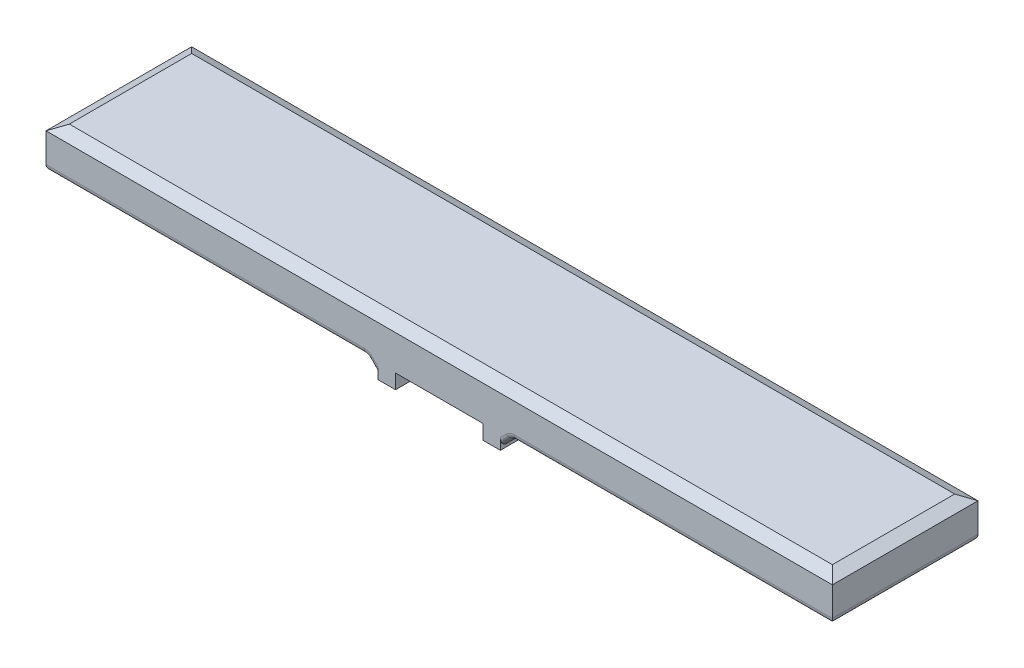
ISO-10303-21;
HEADER;
FILE_DESCRIPTION(('STEP AP214'),'2;1');
FILE_NAME('part.step','',(''),(''),'','','');
FILE_SCHEMA(('AUTOMOTIVE_DESIGN { 1 0 10303 214 1 1 1 1 }'));
ENDSEC;
DATA;
#1=APPLICATION_CONTEXT('core data for automotive mechanical design processes');
#2=APPLICATION_PROTOCOL_DEFINITION('international standard','automotive_design',2000,#1);
#3=PRODUCT_CONTEXT('',#1,'mechanical');
#4=PRODUCT('Part','Part','',(#3));
#5=PRODUCT_RELATED_PRODUCT_CATEGORY('part','',(#4));
#6=PRODUCT_DEFINITION_FORMATION('','',#4);
#7=PRODUCT_DEFINITION_CONTEXT('part definition',#1,'design');
#8=PRODUCT_DEFINITION('design','',#6,#7);
#9=PRODUCT_DEFINITION_SHAPE('','',#8);
#10=(LENGTH_UNIT() NAMED_UNIT(*) SI_UNIT(.MILLI.,.METRE.));
#11=(NAMED_UNIT(*) PLANE_ANGLE_UNIT() SI_UNIT($,.RADIAN.));
#12=(NAMED_UNIT(*) SI_UNIT($,.STERADIAN.) SOLID_ANGLE_UNIT());
#13=UNCERTAINTY_MEASURE_WITH_UNIT(LENGTH_MEASURE(1.E-05),#10,'distance_accuracy_value','');
#14=(GEOMETRIC_REPRESENTATION_CONTEXT(3) GLOBAL_UNCERTAINTY_ASSIGNED_CONTEXT((#13)) GLOBAL_UNIT_ASSIGNED_CONTEXT((#10,
#11,#12)) REPRESENTATION_CONTEXT('',''));
#15=CARTESIAN_POINT('',(0.,0.,0.));
#16=DIRECTION('',(0.,0.,1.));
#17=DIRECTION('',(1.,0.,0.));
#18=AXIS2_PLACEMENT_3D('',#15,#16,#17);
#19=CARTESIAN_POINT('',(0.,0.,0.));
#20=DIRECTION('',(0.,1.,0.));
#21=DIRECTION('',(0.,0.,1.));
#22=AXIS2_PLACEMENT_3D('',#19,#20,#21);
#23=PLANE('',#22);
#24=CARTESIAN_POINT('',(0.,0.,0.));
#25=DIRECTION('',(0.,1.,0.));
#26=DIRECTION('',(0.,0.,1.));
#27=AXIS2_PLACEMENT_3D('',#24,#25,#26);
#28=CIRCLE('',#27,10.);
#29=CARTESIAN_POINT('',(0.,0.,10.));
#30=VERTEX_POINT('',#29);
#31=EDGE_CURVE('E379',#30,#30,#28,.F.);
#32=ORIENTED_EDGE('',*,*,#31,.F.);
#33=EDGE_LOOP('',(#32));
#34=FACE_BOUND('',#33,.T.);
#35=DIRECTION('',(0.,0.,-1.));
#36=VECTOR('',#35,1.);
#37=CARTESIAN_POINT('',(75.,0.,125.));
#38=LINE('',#37,#36);
#39=CARTESIAN_POINT('',(75.,0.,125.));
#40=VERTEX_POINT('',#39);
#41=CARTESIAN_POINT('',(75.,0.,-125.));
#42=VERTEX_POINT('',#41);
#43=EDGE_CURVE('E228',#40,#42,#38,.T.);
#44=ORIENTED_EDGE('',*,*,#43,.F.);
#45=DIRECTION('',(1.,0.,0.));
#46=VECTOR('',#45,1.);
#47=CARTESIAN_POINT('',(-675.,0.,125.));
#48=LINE('',#47,#46);
#49=CARTESIAN_POINT('',(-75.,0.,125.));
#50=VERTEX_POINT('',#49);
#51=EDGE_CURVE('E259',#50,#40,#48,.T.);
#52=ORIENTED_EDGE('',*,*,#51,.F.);
#53=DIRECTION('',(0.,0.,1.));
#54=VECTOR('',#53,1.);
#55=CARTESIAN_POINT('',(-75.,0.,125.));
#56=LINE('',#55,#54);
#57=CARTESIAN_POINT('',(-75.,0.,-125.));
#58=VERTEX_POINT('',#57);
#59=EDGE_CURVE('E231',#58,#50,#56,.T.);
#60=ORIENTED_EDGE('',*,*,#59,.F.);
#61=DIRECTION('',(1.,0.,0.));
#62=VECTOR('',#61,1.);
#63=CARTESIAN_POINT('',(-675.,0.,-125.));
#64=LINE('',#63,#62);
#65=EDGE_CURVE('E262',#58,#42,#64,.T.);
#66=ORIENTED_EDGE('',*,*,#65,.T.);
#67=EDGE_LOOP('',(#44,#52,#60,#66));
#68=FACE_BOUND('',#67,.T.);
#69=ADVANCED_FACE('F34',(#34,#68),#23,.F.);
#70=DIRECTION('',(1.,0.,0.));
#71=VECTOR('',#70,1.);
#72=CARTESIAN_POINT('',(675.,0.,-115.));
#73=LINE('',#72,#71);
#74=CARTESIAN_POINT('',(129.142135623731,0.,-115.));
#75=VERTEX_POINT('',#74);
#76=CARTESIAN_POINT('',(665.,0.,-115.));
#77=VERTEX_POINT('',#76);
#78=EDGE_CURVE('E354',#75,#77,#73,.T.);
#79=ORIENTED_EDGE('',*,*,#78,.T.);
#80=DIRECTION('',(0.,0.,1.));
#81=VECTOR('',#80,1.);
#82=CARTESIAN_POINT('',(665.,0.,125.));
#83=LINE('',#82,#81);
#84=CARTESIAN_POINT('',(665.,0.,115.));
#85=VERTEX_POINT('',#84);
#86=EDGE_CURVE('E356',#77,#85,#83,.T.);
#87=ORIENTED_EDGE('',*,*,#86,.T.);
#88=DIRECTION('',(1.,0.,0.));
#89=VECTOR('',#88,1.);
#90=CARTESIAN_POINT('',(0.,0.,115.));
#91=LINE('',#90,#89);
#92=CARTESIAN_POINT('',(129.142135623731,0.,115.));
#93=VERTEX_POINT('',#92);
#94=EDGE_CURVE('E350',#85,#93,#91,.F.);
#95=ORIENTED_EDGE('',*,*,#94,.T.);
#96=DIRECTION('',(0.,0.,1.));
#97=VECTOR('',#96,1.);
#98=CARTESIAN_POINT('',(129.142135623731,0.,-125.));
#99=LINE('',#98,#97);
#100=EDGE_CURVE('E352',#93,#75,#99,.F.);
#101=ORIENTED_EDGE('',*,*,#100,.T.);
#102=EDGE_LOOP('',(#79,#87,#95,#101));
#103=FACE_BOUND('',#102,.T.);
#104=ADVANCED_FACE('F441',(#103),#23,.F.);
#105=DIRECTION('',(1.,0.,0.));
#106=VECTOR('',#105,1.);
#107=CARTESIAN_POINT('',(0.,0.,115.));
#108=LINE('',#107,#106);
#109=CARTESIAN_POINT('',(-129.142135623731,0.,115.));
#110=VERTEX_POINT('',#109);
#111=CARTESIAN_POINT('',(-665.,0.,115.));
#112=VERTEX_POINT('',#111);
#113=EDGE_CURVE('E50',#110,#112,#108,.F.);
#114=ORIENTED_EDGE('',*,*,#113,.T.);
#115=DIRECTION('',(0.,0.,1.));
#116=VECTOR('',#115,1.);
#117=CARTESIAN_POINT('',(-665.,0.,0.));
#118=LINE('',#117,#116);
#119=CARTESIAN_POINT('',(-665.,0.,-115.));
#120=VERTEX_POINT('',#119);
#121=EDGE_CURVE('E367',#112,#120,#118,.F.);
#122=ORIENTED_EDGE('',*,*,#121,.T.);
#123=DIRECTION('',(1.,0.,0.));
#124=VECTOR('',#123,1.);
#125=CARTESIAN_POINT('',(-125.,0.,-115.));
#126=LINE('',#125,#124);
#127=CARTESIAN_POINT('',(-129.142135623731,0.,-115.));
#128=VERTEX_POINT('',#127);
#129=EDGE_CURVE('E363',#120,#128,#126,.T.);
#130=ORIENTED_EDGE('',*,*,#129,.T.);
#131=DIRECTION('',(0.,0.,-1.));
#132=VECTOR('',#131,1.);
#133=CARTESIAN_POINT('',(-129.142135623731,0.,125.));
#134=LINE('',#133,#132);
#135=EDGE_CURVE('E55',#128,#110,#134,.F.);
#136=ORIENTED_EDGE('',*,*,#135,.T.);
#137=EDGE_LOOP('',(#114,#122,#130,#136));
#138=FACE_BOUND('',#137,.T.);
#139=ADVANCED_FACE('F444',(#138),#23,.F.);
#140=CARTESIAN_POINT('',(-675.,70.,-125.));
#141=DIRECTION('',(1.,0.,0.));
#142=DIRECTION('',(0.,0.,-1.));
#143=AXIS2_PLACEMENT_3D('',#140,#141,#142);
#144=PLANE('',#143);
#145=DIRECTION('',(0.,-1.,0.));
#146=VECTOR('',#145,1.);
#147=CARTESIAN_POINT('',(-675.,70.,-125.));
#148=LINE('',#147,#146);
#149=CARTESIAN_POINT('',(-675.,60.,-125.));
#150=VERTEX_POINT('',#149);
#151=CARTESIAN_POINT('',(-675.,10.,-125.));
#152=VERTEX_POINT('',#151);
#153=EDGE_CURVE('E265',#150,#152,#148,.T.);
#154=ORIENTED_EDGE('',*,*,#153,.T.);
#155=DIRECTION('',(0.,0.,1.));
#156=VECTOR('',#155,1.);
#157=CARTESIAN_POINT('',(-675.,10.,-125.));
#158=LINE('',#157,#156);
#159=CARTESIAN_POINT('',(-675.,10.,125.));
#160=VERTEX_POINT('',#159);
#161=EDGE_CURVE('E361',#152,#160,#158,.T.);
#162=ORIENTED_EDGE('',*,*,#161,.T.);
#163=DIRECTION('',(0.,-1.,0.));
#164=VECTOR('',#163,1.);
#165=CARTESIAN_POINT('',(-675.,70.,125.));
#166=LINE('',#165,#164);
#167=CARTESIAN_POINT('',(-675.,60.,125.));
#168=VERTEX_POINT('',#167);
#169=EDGE_CURVE('E274',#168,#160,#166,.T.);
#170=ORIENTED_EDGE('',*,*,#169,.F.);
#171=DIRECTION('',(0.,0.,-1.));
#172=VECTOR('',#171,1.);
#173=CARTESIAN_POINT('',(-675.,60.,-125.));
#174=LINE('',#173,#172);
#175=EDGE_CURVE('E293',#168,#150,#174,.T.);
#176=ORIENTED_EDGE('',*,*,#175,.T.);
#177=EDGE_LOOP('',(#154,#162,#170,#176));
#178=FACE_BOUND('',#177,.T.);
#179=ADVANCED_FACE('F454',(#178),#144,.F.);
#180=CARTESIAN_POINT('',(-675.,70.,125.));
#181=DIRECTION('',(0.,0.,-1.));
#182=DIRECTION('',(-1.,0.,0.));
#183=AXIS2_PLACEMENT_3D('',#180,#181,#182);
#184=PLANE('',#183);
#185=DIRECTION('',(0.,1.,0.));
#186=VECTOR('',#185,1.);
#187=CARTESIAN_POINT('',(105.,-25.,125.));
#188=LINE('',#187,#186);
#189=CARTESIAN_POINT('',(105.,-25.,125.));
#190=VERTEX_POINT('',#189);
#191=CARTESIAN_POINT('',(105.,-5.85786437626877,125.));
#192=VERTEX_POINT('',#191);
#193=EDGE_CURVE('E236',#190,#192,#188,.T.);
#194=ORIENTED_EDGE('',*,*,#193,.T.);
#195=DIRECTION('',(-0.707106781186546,-0.70710678118655,0.));
#196=VECTOR('',#195,1.);
#197=CARTESIAN_POINT('',(-247.071067811863,-357.928932188134,125.));
#198=LINE('',#197,#196);
#199=CARTESIAN_POINT('',(115.,4.14213562373093,125.));
#200=VERTEX_POINT('',#199);
#201=EDGE_CURVE('E342',#192,#200,#198,.F.);
#202=ORIENTED_EDGE('',*,*,#201,.T.);
#203=CARTESIAN_POINT('',(129.142135623731,-10.,125.));
#204=DIRECTION('',(0.,0.,-1.));
#205=DIRECTION('',(-1.,0.,0.));
#206=AXIS2_PLACEMENT_3D('',#203,#204,#205);
#207=CIRCLE('',#206,20.);
#208=CARTESIAN_POINT('',(129.142135623731,10.,125.));
#209=VERTEX_POINT('',#208);
#210=EDGE_CURVE('E339',#209,#200,#207,.F.);
#211=ORIENTED_EDGE('',*,*,#210,.F.);
#212=DIRECTION('',(1.,0.,0.));
#213=VECTOR('',#212,1.);
#214=CARTESIAN_POINT('',(-675.,10.,125.));
#215=LINE('',#214,#213);
#216=CARTESIAN_POINT('',(675.,10.,125.));
#217=VERTEX_POINT('',#216);
#218=EDGE_CURVE('E337',#209,#217,#215,.T.);
#219=ORIENTED_EDGE('',*,*,#218,.T.);
#220=DIRECTION('',(0.,-1.,0.));
#221=VECTOR('',#220,1.);
#222=CARTESIAN_POINT('',(675.,70.,125.));
#223=LINE('',#222,#221);
#224=CARTESIAN_POINT('',(675.,60.,125.));
#225=VERTEX_POINT('',#224);
#226=EDGE_CURVE('E271',#225,#217,#223,.T.);
#227=ORIENTED_EDGE('',*,*,#226,.F.);
#228=DIRECTION('',(-1.,0.,0.));
#229=VECTOR('',#228,1.);
#230=CARTESIAN_POINT('',(-675.,60.,125.));
#231=LINE('',#230,#229);
#232=EDGE_CURVE('E291',#225,#168,#231,.T.);
#233=ORIENTED_EDGE('',*,*,#232,.T.);
#234=ORIENTED_EDGE('',*,*,#169,.T.);
#235=DIRECTION('',(1.,0.,0.));
#236=VECTOR('',#235,1.);
#237=CARTESIAN_POINT('',(-675.,10.,125.));
#238=LINE('',#237,#236);
#239=CARTESIAN_POINT('',(-129.142135623731,10.,125.));
#240=VERTEX_POINT('',#239);
#241=EDGE_CURVE('E332',#160,#240,#238,.T.);
#242=ORIENTED_EDGE('',*,*,#241,.T.);
#243=CARTESIAN_POINT('',(-129.142135623731,-10.,125.));
#244=DIRECTION('',(0.,0.,-1.));
#245=DIRECTION('',(-1.,0.,0.));
#246=AXIS2_PLACEMENT_3D('',#243,#244,#245);
#247=CIRCLE('',#246,20.);
#248=CARTESIAN_POINT('',(-115.,4.1421356237309,125.));
#249=VERTEX_POINT('',#248);
#250=EDGE_CURVE('E329',#249,#240,#247,.F.);
#251=ORIENTED_EDGE('',*,*,#250,.F.);
#252=DIRECTION('',(-0.707106781186546,0.70710678118655,0.));
#253=VECTOR('',#252,1.);
#254=CARTESIAN_POINT('',(-427.928932188133,317.071067811866,125.));
#255=LINE('',#254,#253);
#256=CARTESIAN_POINT('',(-105.,-5.85786437626883,125.));
#257=VERTEX_POINT('',#256);
#258=EDGE_CURVE('E334',#249,#257,#255,.F.);
#259=ORIENTED_EDGE('',*,*,#258,.T.);
#260=DIRECTION('',(0.,1.,0.));
#261=VECTOR('',#260,1.);
#262=CARTESIAN_POINT('',(-105.,-25.,125.));
#263=LINE('',#262,#261);
#264=CARTESIAN_POINT('',(-105.,-25.,125.));
#265=VERTEX_POINT('',#264);
#266=EDGE_CURVE('E256',#265,#257,#263,.T.);
#267=ORIENTED_EDGE('',*,*,#266,.F.);
#268=DIRECTION('',(-1.,0.,0.));
#269=VECTOR('',#268,1.);
#270=CARTESIAN_POINT('',(-105.,-25.,125.));
#271=LINE('',#270,#269);
#272=CARTESIAN_POINT('',(-75.,-25.,125.));
#273=VERTEX_POINT('',#272);
#274=EDGE_CURVE('E234',#273,#265,#271,.T.);
#275=ORIENTED_EDGE('',*,*,#274,.F.);
#276=DIRECTION('',(0.,1.,0.));
#277=VECTOR('',#276,1.);
#278=CARTESIAN_POINT('',(-75.,-25.,125.));
#279=LINE('',#278,#277);
#280=EDGE_CURVE('E247',#273,#50,#279,.T.);
#281=ORIENTED_EDGE('',*,*,#280,.T.);
#282=ORIENTED_EDGE('',*,*,#51,.T.);
#283=DIRECTION('',(0.,1.,0.));
#284=VECTOR('',#283,1.);
#285=CARTESIAN_POINT('',(75.,-25.,125.));
#286=LINE('',#285,#284);
#287=CARTESIAN_POINT('',(75.,-25.,125.));
#288=VERTEX_POINT('',#287);
#289=EDGE_CURVE('E644',#288,#40,#286,.T.);
#290=ORIENTED_EDGE('',*,*,#289,.F.);
#291=DIRECTION('',(-1.,0.,0.));
#292=VECTOR('',#291,1.);
#293=CARTESIAN_POINT('',(105.,-25.,125.));
#294=LINE('',#293,#292);
#295=EDGE_CURVE('E224',#190,#288,#294,.T.);
#296=ORIENTED_EDGE('',*,*,#295,.F.);
#297=EDGE_LOOP('',(#194,#202,#211,#219,#227,#233,#234,#242,#251,#259,#267,#275,#281,#282,#290,#296));
#298=FACE_BOUND('',#297,.T.);
#299=ADVANCED_FACE('F458',(#298),#184,.F.);
#300=CARTESIAN_POINT('',(675.,70.,-125.));
#301=DIRECTION('',(1.,0.,0.));
#302=DIRECTION('',(0.,0.,-1.));
#303=AXIS2_PLACEMENT_3D('',#300,#301,#302);
#304=PLANE('',#303);
#305=ORIENTED_EDGE('',*,*,#226,.T.);
#306=DIRECTION('',(0.,0.,1.));
#307=VECTOR('',#306,1.);
#308=CARTESIAN_POINT('',(675.,10.,-125.));
#309=LINE('',#308,#307);
#310=CARTESIAN_POINT('',(675.,10.,-125.));
#311=VERTEX_POINT('',#310);
#312=EDGE_CURVE('E359',#217,#311,#309,.F.);
#313=ORIENTED_EDGE('',*,*,#312,.T.);
#314=DIRECTION('',(0.,-1.,0.));
#315=VECTOR('',#314,1.);
#316=CARTESIAN_POINT('',(675.,70.,-125.));
#317=LINE('',#316,#315);
#318=CARTESIAN_POINT('',(675.,60.,-125.));
#319=VERTEX_POINT('',#318);
#320=EDGE_CURVE('E268',#319,#311,#317,.T.);
#321=ORIENTED_EDGE('',*,*,#320,.F.);
#322=DIRECTION('',(0.,0.,1.));
#323=VECTOR('',#322,1.);
#324=CARTESIAN_POINT('',(675.,60.,-125.));
#325=LINE('',#324,#323);
#326=EDGE_CURVE('E289',#319,#225,#325,.T.);
#327=ORIENTED_EDGE('',*,*,#326,.T.);
#328=EDGE_LOOP('',(#305,#313,#321,#327));
#329=FACE_BOUND('',#328,.T.);
#330=ADVANCED_FACE('F464',(#329),#304,.T.);
#331=CARTESIAN_POINT('',(-675.,70.,-125.));
#332=DIRECTION('',(0.,0.,-1.));
#333=DIRECTION('',(-1.,0.,0.));
#334=AXIS2_PLACEMENT_3D('',#331,#332,#333);
#335=PLANE('',#334);
#336=DIRECTION('',(0.707106781186546,0.70710678118655,0.));
#337=VECTOR('',#336,1.);
#338=CARTESIAN_POINT('',(97.9289321881345,-12.9289321881343,-125.));
#339=LINE('',#338,#337);
#340=CARTESIAN_POINT('',(115.,4.14213562373095,-125.));
#341=VERTEX_POINT('',#340);
#342=CARTESIAN_POINT('',(105.,-5.85786437626875,-125.));
#343=VERTEX_POINT('',#342);
#344=EDGE_CURVE('E321',#341,#343,#339,.F.);
#345=ORIENTED_EDGE('',*,*,#344,.T.);
#346=DIRECTION('',(0.,1.,0.));
#347=VECTOR('',#346,1.);
#348=CARTESIAN_POINT('',(105.,-25.,-125.));
#349=LINE('',#348,#347);
#350=CARTESIAN_POINT('',(105.,-25.,-125.));
#351=VERTEX_POINT('',#350);
#352=EDGE_CURVE('E215',#351,#343,#349,.T.);
#353=ORIENTED_EDGE('',*,*,#352,.F.);
#354=DIRECTION('',(1.,0.,0.));
#355=VECTOR('',#354,1.);
#356=CARTESIAN_POINT('',(105.,-25.,-125.));
#357=LINE('',#356,#355);
#358=CARTESIAN_POINT('',(75.,-25.,-125.));
#359=VERTEX_POINT('',#358);
#360=EDGE_CURVE('E207',#359,#351,#357,.T.);
#361=ORIENTED_EDGE('',*,*,#360,.F.);
#362=DIRECTION('',(0.,1.,0.));
#363=VECTOR('',#362,1.);
#364=CARTESIAN_POINT('',(75.,-25.,-125.));
#365=LINE('',#364,#363);
#366=EDGE_CURVE('E213',#359,#42,#365,.T.);
#367=ORIENTED_EDGE('',*,*,#366,.T.);
#368=ORIENTED_EDGE('',*,*,#65,.F.);
#369=DIRECTION('',(0.,1.,0.));
#370=VECTOR('',#369,1.);
#371=CARTESIAN_POINT('',(-75.,-25.,-125.));
#372=LINE('',#371,#370);
#373=CARTESIAN_POINT('',(-75.,-25.,-125.));
#374=VERTEX_POINT('',#373);
#375=EDGE_CURVE('E251',#374,#58,#372,.T.);
#376=ORIENTED_EDGE('',*,*,#375,.F.);
#377=DIRECTION('',(1.,0.,0.));
#378=VECTOR('',#377,1.);
#379=CARTESIAN_POINT('',(-105.,-25.,-125.));
#380=LINE('',#379,#378);
#381=CARTESIAN_POINT('',(-105.,-25.,-125.));
#382=VERTEX_POINT('',#381);
#383=EDGE_CURVE('E244',#382,#374,#380,.T.);
#384=ORIENTED_EDGE('',*,*,#383,.F.);
#385=DIRECTION('',(0.,1.,0.));
#386=VECTOR('',#385,1.);
#387=CARTESIAN_POINT('',(-105.,-25.,-125.));
#388=LINE('',#387,#386);
#389=CARTESIAN_POINT('',(-105.,-5.85786437626886,-125.));
#390=VERTEX_POINT('',#389);
#391=EDGE_CURVE('E254',#382,#390,#388,.T.);
#392=ORIENTED_EDGE('',*,*,#391,.T.);
#393=DIRECTION('',(0.707106781186546,-0.70710678118655,0.));
#394=VECTOR('',#393,1.);
#395=CARTESIAN_POINT('',(-117.928932188134,7.07106781186539,-125.));
#396=LINE('',#395,#394);
#397=CARTESIAN_POINT('',(-115.,4.14213562373089,-125.));
#398=VERTEX_POINT('',#397);
#399=EDGE_CURVE('E314',#390,#398,#396,.F.);
#400=ORIENTED_EDGE('',*,*,#399,.T.);
#401=CARTESIAN_POINT('',(-129.142135623731,-10.,-125.));
#402=DIRECTION('',(0.,0.,-1.));
#403=DIRECTION('',(-1.,0.,0.));
#404=AXIS2_PLACEMENT_3D('',#401,#402,#403);
#405=CIRCLE('',#404,20.);
#406=CARTESIAN_POINT('',(-129.142135623731,10.,-125.));
#407=VERTEX_POINT('',#406);
#408=EDGE_CURVE('E311',#407,#398,#405,.T.);
#409=ORIENTED_EDGE('',*,*,#408,.F.);
#410=DIRECTION('',(1.,0.,0.));
#411=VECTOR('',#410,1.);
#412=CARTESIAN_POINT('',(-675.,10.,-125.));
#413=LINE('',#412,#411);
#414=EDGE_CURVE('E309',#407,#152,#413,.F.);
#415=ORIENTED_EDGE('',*,*,#414,.T.);
#416=ORIENTED_EDGE('',*,*,#153,.F.);
#417=DIRECTION('',(1.,0.,0.));
#418=VECTOR('',#417,1.);
#419=CARTESIAN_POINT('',(-675.,60.,-125.));
#420=LINE('',#419,#418);
#421=EDGE_CURVE('E277',#150,#319,#420,.T.);
#422=ORIENTED_EDGE('',*,*,#421,.T.);
#423=ORIENTED_EDGE('',*,*,#320,.T.);
#424=DIRECTION('',(1.,0.,0.));
#425=VECTOR('',#424,1.);
#426=CARTESIAN_POINT('',(125.,10.,-125.));
#427=LINE('',#426,#425);
#428=CARTESIAN_POINT('',(129.142135623731,10.,-125.));
#429=VERTEX_POINT('',#428);
#430=EDGE_CURVE('E319',#311,#429,#427,.F.);
#431=ORIENTED_EDGE('',*,*,#430,.T.);
#432=CARTESIAN_POINT('',(129.142135623731,-10.,-125.));
#433=DIRECTION('',(0.,0.,-1.));
#434=DIRECTION('',(-1.,0.,0.));
#435=AXIS2_PLACEMENT_3D('',#432,#433,#434);
#436=CIRCLE('',#435,20.);
#437=EDGE_CURVE('E316',#341,#429,#436,.T.);
#438=ORIENTED_EDGE('',*,*,#437,.F.);
#439=EDGE_LOOP('',(#345,#353,#361,#367,#368,#376,#384,#392,#400,#409,#415,#416,#422,#423,#431,#438));
#440=FACE_BOUND('',#439,.T.);
#441=ADVANCED_FACE('F210',(#440),#335,.T.);
#442=CARTESIAN_POINT('',(0.,70.,0.));
#443=DIRECTION('',(0.,1.,0.));
#444=DIRECTION('',(0.,0.,1.));
#445=AXIS2_PLACEMENT_3D('',#442,#443,#444);
#446=PLANE('',#445);
#447=DIRECTION('',(0.,0.,-1.));
#448=VECTOR('',#447,1.);
#449=CARTESIAN_POINT('',(655.,70.,-2.90878432451791E-13));
#450=LINE('',#449,#448);
#451=CARTESIAN_POINT('',(655.,70.,105.));
#452=VERTEX_POINT('',#451);
#453=CARTESIAN_POINT('',(655.,70.,-105.));
#454=VERTEX_POINT('',#453);
#455=EDGE_CURVE('E284',#452,#454,#450,.T.);
#456=ORIENTED_EDGE('',*,*,#455,.T.);
#457=DIRECTION('',(-1.,0.,0.));
#458=VECTOR('',#457,1.);
#459=CARTESIAN_POINT('',(0.,70.,-105.));
#460=LINE('',#459,#458);
#461=CARTESIAN_POINT('',(-655.,70.,-105.));
#462=VERTEX_POINT('',#461);
#463=EDGE_CURVE('E286',#454,#462,#460,.T.);
#464=ORIENTED_EDGE('',*,*,#463,.T.);
#465=DIRECTION('',(0.,0.,1.));
#466=VECTOR('',#465,1.);
#467=CARTESIAN_POINT('',(-655.,70.,125.));
#468=LINE('',#467,#466);
#469=CARTESIAN_POINT('',(-655.,70.,105.));
#470=VERTEX_POINT('',#469);
#471=EDGE_CURVE('E280',#462,#470,#468,.T.);
#472=ORIENTED_EDGE('',*,*,#471,.T.);
#473=DIRECTION('',(1.,0.,0.));
#474=VECTOR('',#473,1.);
#475=CARTESIAN_POINT('',(675.,70.,105.));
#476=LINE('',#475,#474);
#477=EDGE_CURVE('E282',#470,#452,#476,.T.);
#478=ORIENTED_EDGE('',*,*,#477,.T.);
#479=EDGE_LOOP('',(#456,#464,#472,#478));
#480=FACE_BOUND('',#479,.T.);
#481=ADVANCED_FACE('F498',(#480),#446,.T.);
#482=CARTESIAN_POINT('',(0.,70.,105.));
#483=DIRECTION('',(0.,0.894427190999918,0.447213595499954));
#484=DIRECTION('',(-1.,0.,0.));
#485=AXIS2_PLACEMENT_3D('',#482,#483,#484);
#486=PLANE('',#485);
#487=DIRECTION('',(0.666666666666669,-0.33333333333333,0.666666666666667));
#488=VECTOR('',#487,1.);
#489=CARTESIAN_POINT('',(363.888888888887,215.555555555554,-186.111111111112));
#490=LINE('',#489,#488);
#491=EDGE_CURVE('E299',#452,#225,#490,.T.);
#492=ORIENTED_EDGE('',*,*,#491,.F.);
#493=ORIENTED_EDGE('',*,*,#477,.F.);
#494=DIRECTION('',(0.666666666666668,0.33333333333333,-0.666666666666668));
#495=VECTOR('',#494,1.);
#496=CARTESIAN_POINT('',(-608.333333333333,93.3333333333331,58.3333333333331));
#497=LINE('',#496,#495);
#498=EDGE_CURVE('E263',#168,#470,#497,.T.);
#499=ORIENTED_EDGE('',*,*,#498,.F.);
#500=ORIENTED_EDGE('',*,*,#232,.F.);
#501=EDGE_LOOP('',(#492,#493,#499,#500));
#502=FACE_BOUND('',#501,.T.);
#503=ADVANCED_FACE('F492',(#502),#486,.T.);
#504=CARTESIAN_POINT('',(-655.,70.,0.));
#505=DIRECTION('',(-0.447213595499954,0.894427190999918,0.));
#506=DIRECTION('',(0.,0.,-1.));
#507=AXIS2_PLACEMENT_3D('',#504,#505,#506);
#508=PLANE('',#507);
#509=ORIENTED_EDGE('',*,*,#498,.T.);
#510=ORIENTED_EDGE('',*,*,#471,.F.);
#511=DIRECTION('',(0.666666666666668,0.33333333333333,0.666666666666668));
#512=VECTOR('',#511,1.);
#513=CARTESIAN_POINT('',(-608.333333333333,93.3333333333331,-58.3333333333331));
#514=LINE('',#513,#512);
#515=EDGE_CURVE('E297',#150,#462,#514,.T.);
#516=ORIENTED_EDGE('',*,*,#515,.F.);
#517=ORIENTED_EDGE('',*,*,#175,.F.);
#518=EDGE_LOOP('',(#509,#510,#516,#517));
#519=FACE_BOUND('',#518,.T.);
#520=ADVANCED_FACE('F485',(#519),#508,.T.);
#521=CARTESIAN_POINT('',(675.,60.,-125.));
#522=DIRECTION('',(-0.447213595499953,-0.894427190999918,0.));
#523=DIRECTION('',(0.,0.,1.));
#524=AXIS2_PLACEMENT_3D('',#521,#522,#523);
#525=PLANE('',#524);
#526=ORIENTED_EDGE('',*,*,#491,.T.);
#527=ORIENTED_EDGE('',*,*,#326,.F.);
#528=DIRECTION('',(-0.666666666666668,0.33333333333333,0.666666666666667));
#529=VECTOR('',#528,1.);
#530=CARTESIAN_POINT('',(675.,60.,-125.));
#531=LINE('',#530,#529);
#532=EDGE_CURVE('E258',#454,#319,#531,.F.);
#533=ORIENTED_EDGE('',*,*,#532,.F.);
#534=ORIENTED_EDGE('',*,*,#455,.F.);
#535=EDGE_LOOP('',(#526,#527,#533,#534));
#536=FACE_BOUND('',#535,.T.);
#537=ADVANCED_FACE('F478',(#536),#525,.F.);
#538=CARTESIAN_POINT('',(-675.,60.,-125.));
#539=DIRECTION('',(0.,-0.894427190999918,0.447213595499954));
#540=DIRECTION('',(1.,0.,0.));
#541=AXIS2_PLACEMENT_3D('',#538,#539,#540);
#542=PLANE('',#541);
#543=ORIENTED_EDGE('',*,*,#515,.T.);
#544=ORIENTED_EDGE('',*,*,#463,.F.);
#545=ORIENTED_EDGE('',*,*,#532,.T.);
#546=ORIENTED_EDGE('',*,*,#421,.F.);
#547=EDGE_LOOP('',(#543,#544,#545,#546));
#548=FACE_BOUND('',#547,.T.);
#549=ADVANCED_FACE('F470',(#548),#542,.F.);
#550=CARTESIAN_POINT('',(-105.,-25.,125.));
#551=DIRECTION('',(1.,0.,0.));
#552=DIRECTION('',(0.,0.,-1.));
#553=AXIS2_PLACEMENT_3D('',#550,#551,#552);
#554=PLANE('',#553);
#555=ORIENTED_EDGE('',*,*,#266,.T.);
#556=CARTESIAN_POINT('',(-105.,-5.85786437626878,115.));
#557=DIRECTION('',(1.,0.,0.));
#558=DIRECTION('',(0.,1.,0.));
#559=AXIS2_PLACEMENT_3D('',#556,#557,#558);
#560=ELLIPSE('',#559,14.142135623731,10.);
#561=CARTESIAN_POINT('',(-105.,-19.9999999999998,115.));
#562=VERTEX_POINT('',#561);
#563=EDGE_CURVE('E374',#257,#562,#560,.T.);
#564=ORIENTED_EDGE('',*,*,#563,.T.);
#565=DIRECTION('',(0.,0.,-1.));
#566=VECTOR('',#565,1.);
#567=CARTESIAN_POINT('',(-105.,-19.9999999999998,-125.));
#568=LINE('',#567,#566);
#569=CARTESIAN_POINT('',(-105.,-19.9999999999998,-115.));
#570=VERTEX_POINT('',#569);
#571=EDGE_CURVE('E295',#562,#570,#568,.T.);
#572=ORIENTED_EDGE('',*,*,#571,.T.);
#573=CARTESIAN_POINT('',(-105.,-5.85786437626878,-115.));
#574=DIRECTION('',(1.,0.,0.));
#575=DIRECTION('',(0.,1.,0.));
#576=AXIS2_PLACEMENT_3D('',#573,#574,#575);
#577=ELLIPSE('',#576,14.142135623731,10.);
#578=EDGE_CURVE('E376',#570,#390,#577,.T.);
#579=ORIENTED_EDGE('',*,*,#578,.T.);
#580=ORIENTED_EDGE('',*,*,#391,.F.);
#581=DIRECTION('',(0.,0.,-1.));
#582=VECTOR('',#581,1.);
#583=CARTESIAN_POINT('',(-105.,-25.,125.));
#584=LINE('',#583,#582);
#585=EDGE_CURVE('E242',#265,#382,#584,.T.);
#586=ORIENTED_EDGE('',*,*,#585,.F.);
#587=EDGE_LOOP('',(#555,#564,#572,#579,#580,#586));
#588=FACE_BOUND('',#587,.T.);
#589=ADVANCED_FACE('F477',(#588),#554,.F.);
#590=CARTESIAN_POINT('',(-75.,-25.,125.));
#591=DIRECTION('',(-1.,0.,0.));
#592=DIRECTION('',(0.,0.,1.));
#593=AXIS2_PLACEMENT_3D('',#590,#591,#592);
#594=PLANE('',#593);
#595=ORIENTED_EDGE('',*,*,#59,.T.);
#596=ORIENTED_EDGE('',*,*,#280,.F.);
#597=DIRECTION('',(0.,0.,1.));
#598=VECTOR('',#597,1.);
#599=CARTESIAN_POINT('',(-75.,-25.,125.));
#600=LINE('',#599,#598);
#601=EDGE_CURVE('E246',#374,#273,#600,.T.);
#602=ORIENTED_EDGE('',*,*,#601,.F.);
#603=ORIENTED_EDGE('',*,*,#375,.T.);
#604=EDGE_LOOP('',(#595,#596,#602,#603));
#605=FACE_BOUND('',#604,.T.);
#606=ADVANCED_FACE('F652',(#605),#594,.F.);
#607=CARTESIAN_POINT('',(0.,-25.,0.));
#608=DIRECTION('',(0.,1.,0.));
#609=DIRECTION('',(0.,0.,1.));
#610=AXIS2_PLACEMENT_3D('',#607,#608,#609);
#611=PLANE('',#610);
#612=ORIENTED_EDGE('',*,*,#274,.T.);
#613=ORIENTED_EDGE('',*,*,#585,.T.);
#614=ORIENTED_EDGE('',*,*,#383,.T.);
#615=ORIENTED_EDGE('',*,*,#601,.T.);
#616=EDGE_LOOP('',(#612,#613,#614,#615));
#617=FACE_BOUND('',#616,.T.);
#618=ADVANCED_FACE('F656',(#617),#611,.F.);
#619=CARTESIAN_POINT('',(75.,-25.,125.));
#620=DIRECTION('',(1.,0.,0.));
#621=DIRECTION('',(0.,0.,-1.));
#622=AXIS2_PLACEMENT_3D('',#619,#620,#621);
#623=PLANE('',#622);
#624=ORIENTED_EDGE('',*,*,#43,.T.);
#625=ORIENTED_EDGE('',*,*,#366,.F.);
#626=DIRECTION('',(0.,0.,-1.));
#627=VECTOR('',#626,1.);
#628=CARTESIAN_POINT('',(75.,-25.,125.));
#629=LINE('',#628,#627);
#630=EDGE_CURVE('E219',#288,#359,#629,.T.);
#631=ORIENTED_EDGE('',*,*,#630,.F.);
#632=ORIENTED_EDGE('',*,*,#289,.T.);
#633=EDGE_LOOP('',(#624,#625,#631,#632));
#634=FACE_BOUND('',#633,.T.);
#635=ADVANCED_FACE('F230',(#634),#623,.F.);
#636=CARTESIAN_POINT('',(105.,-25.,125.));
#637=DIRECTION('',(-1.,0.,0.));
#638=DIRECTION('',(0.,0.,1.));
#639=AXIS2_PLACEMENT_3D('',#636,#637,#638);
#640=PLANE('',#639);
#641=ORIENTED_EDGE('',*,*,#352,.T.);
#642=CARTESIAN_POINT('',(105.,-5.85786437626873,-115.));
#643=DIRECTION('',(-1.,0.,0.));
#644=DIRECTION('',(0.,-1.,0.));
#645=AXIS2_PLACEMENT_3D('',#642,#643,#644);
#646=ELLIPSE('',#645,14.142135623731,10.);
#647=CARTESIAN_POINT('',(105.,-19.9999999999998,-115.));
#648=VERTEX_POINT('',#647);
#649=EDGE_CURVE('E369',#343,#648,#646,.T.);
#650=ORIENTED_EDGE('',*,*,#649,.T.);
#651=DIRECTION('',(0.,0.,1.));
#652=VECTOR('',#651,1.);
#653=CARTESIAN_POINT('',(105.,-19.9999999999998,125.));
#654=LINE('',#653,#652);
#655=CARTESIAN_POINT('',(105.,-19.9999999999998,115.));
#656=VERTEX_POINT('',#655);
#657=EDGE_CURVE('E306',#648,#656,#654,.T.);
#658=ORIENTED_EDGE('',*,*,#657,.T.);
#659=CARTESIAN_POINT('',(105.,-5.85786437626873,115.));
#660=DIRECTION('',(-1.,0.,0.));
#661=DIRECTION('',(0.,-1.,0.));
#662=AXIS2_PLACEMENT_3D('',#659,#660,#661);
#663=ELLIPSE('',#662,14.142135623731,10.);
#664=EDGE_CURVE('E371',#656,#192,#663,.T.);
#665=ORIENTED_EDGE('',*,*,#664,.T.);
#666=ORIENTED_EDGE('',*,*,#193,.F.);
#667=DIRECTION('',(0.,0.,1.));
#668=VECTOR('',#667,1.);
#669=CARTESIAN_POINT('',(105.,-25.,125.));
#670=LINE('',#669,#668);
#671=EDGE_CURVE('E218',#351,#190,#670,.T.);
#672=ORIENTED_EDGE('',*,*,#671,.F.);
#673=EDGE_LOOP('',(#641,#650,#658,#665,#666,#672));
#674=FACE_BOUND('',#673,.T.);
#675=ADVANCED_FACE('F633',(#674),#640,.F.);
#676=CARTESIAN_POINT('',(0.,-25.,0.));
#677=DIRECTION('',(0.,1.,0.));
#678=DIRECTION('',(0.,0.,1.));
#679=AXIS2_PLACEMENT_3D('',#676,#677,#678);
#680=PLANE('',#679);
#681=ORIENTED_EDGE('',*,*,#630,.T.);
#682=ORIENTED_EDGE('',*,*,#360,.T.);
#683=ORIENTED_EDGE('',*,*,#671,.T.);
#684=ORIENTED_EDGE('',*,*,#295,.T.);
#685=EDGE_LOOP('',(#681,#682,#683,#684));
#686=FACE_BOUND('',#685,.T.);
#687=ADVANCED_FACE('F222',(#686),#680,.F.);
#688=CARTESIAN_POINT('',(-105.,-19.9999999999998,125.));
#689=DIRECTION('',(-0.707106781186549,-0.707106781186545,0.));
#690=DIRECTION('',(0.,0.,1.));
#691=AXIS2_PLACEMENT_3D('',#688,#689,#690);
#692=PLANE('',#691);
#693=ORIENTED_EDGE('',*,*,#571,.F.);
#694=DIRECTION('',(0.707106781186546,-0.70710678118655,0.));
#695=VECTOR('',#694,1.);
#696=CARTESIAN_POINT('',(-105.,-19.9999999999998,115.));
#697=LINE('',#696,#695);
#698=CARTESIAN_POINT('',(-122.071067811865,-2.92893218813454,115.));
#699=VERTEX_POINT('',#698);
#700=EDGE_CURVE('E348',#562,#699,#697,.F.);
#701=ORIENTED_EDGE('',*,*,#700,.T.);
#702=DIRECTION('',(0.,0.,1.));
#703=VECTOR('',#702,1.);
#704=CARTESIAN_POINT('',(-122.071067811865,-2.92893218813454,-125.));
#705=LINE('',#704,#703);
#706=CARTESIAN_POINT('',(-122.071067811865,-2.92893218813454,-115.));
#707=VERTEX_POINT('',#706);
#708=EDGE_CURVE('E344',#699,#707,#705,.F.);
#709=ORIENTED_EDGE('',*,*,#708,.T.);
#710=DIRECTION('',(-0.707106781186546,0.70710678118655,0.));
#711=VECTOR('',#710,1.);
#712=CARTESIAN_POINT('',(-105.,-19.9999999999998,-115.));
#713=LINE('',#712,#711);
#714=EDGE_CURVE('E346',#707,#570,#713,.F.);
#715=ORIENTED_EDGE('',*,*,#714,.T.);
#716=EDGE_LOOP('',(#693,#701,#709,#715));
#717=FACE_BOUND('',#716,.T.);
#718=ADVANCED_FACE('F500',(#717),#692,.T.);
#719=CARTESIAN_POINT('',(105.,-19.9999999999998,125.));
#720=DIRECTION('',(0.707106781186549,-0.707106781186545,0.));
#721=DIRECTION('',(0.,0.,-1.));
#722=AXIS2_PLACEMENT_3D('',#719,#720,#721);
#723=PLANE('',#722);
#724=ORIENTED_EDGE('',*,*,#657,.F.);
#725=DIRECTION('',(-0.707106781186546,-0.70710678118655,0.));
#726=VECTOR('',#725,1.);
#727=CARTESIAN_POINT('',(125.,0.,-115.));
#728=LINE('',#727,#726);
#729=CARTESIAN_POINT('',(122.071067811865,-2.92893218813454,-115.));
#730=VERTEX_POINT('',#729);
#731=EDGE_CURVE('E327',#648,#730,#728,.F.);
#732=ORIENTED_EDGE('',*,*,#731,.T.);
#733=DIRECTION('',(0.,0.,-1.));
#734=VECTOR('',#733,1.);
#735=CARTESIAN_POINT('',(122.071067811865,-2.92893218813454,125.));
#736=LINE('',#735,#734);
#737=CARTESIAN_POINT('',(122.071067811865,-2.92893218813454,115.));
#738=VERTEX_POINT('',#737);
#739=EDGE_CURVE('E323',#730,#738,#736,.F.);
#740=ORIENTED_EDGE('',*,*,#739,.T.);
#741=DIRECTION('',(0.707106781186546,0.70710678118655,0.));
#742=VECTOR('',#741,1.);
#743=CARTESIAN_POINT('',(105.,-19.9999999999998,115.));
#744=LINE('',#743,#742);
#745=EDGE_CURVE('E325',#738,#656,#744,.F.);
#746=ORIENTED_EDGE('',*,*,#745,.T.);
#747=EDGE_LOOP('',(#724,#732,#740,#746));
#748=FACE_BOUND('',#747,.T.);
#749=ADVANCED_FACE('F506',(#748),#723,.T.);
#750=CARTESIAN_POINT('',(-247.071067811863,-357.928932188134,115.));
#751=DIRECTION('',(-0.707106781186546,-0.70710678118655,0.));
#752=DIRECTION('',(0.70710678118655,-0.707106781186546,0.));
#753=AXIS2_PLACEMENT_3D('',#750,#751,#752);
#754=CYLINDRICAL_SURFACE('',#753,10.);
#755=ORIENTED_EDGE('',*,*,#664,.F.);
#756=ORIENTED_EDGE('',*,*,#745,.F.);
#757=CARTESIAN_POINT('',(115.,4.14213562373093,115.));
#758=DIRECTION('',(0.707106781186546,0.707106781186549,0.));
#759=DIRECTION('',(-0.707106781186549,0.707106781186546,0.));
#760=AXIS2_PLACEMENT_3D('',#757,#758,#759);
#761=CIRCLE('',#760,10.);
#762=EDGE_CURVE('E401',#200,#738,#761,.T.);
#763=ORIENTED_EDGE('',*,*,#762,.F.);
#764=ORIENTED_EDGE('',*,*,#201,.F.);
#765=EDGE_LOOP('',(#755,#756,#763,#764));
#766=FACE_BOUND('',#765,.T.);
#767=ADVANCED_FACE('F512',(#766),#754,.T.);
#768=CARTESIAN_POINT('',(-675.,10.,115.));
#769=DIRECTION('',(1.,0.,0.));
#770=DIRECTION('',(0.,0.,-1.));
#771=AXIS2_PLACEMENT_3D('',#768,#769,#770);
#772=CYLINDRICAL_SURFACE('',#771,10.);
#773=CARTESIAN_POINT('',(665.,10.,115.));
#774=DIRECTION('',(0.707106781186547,0.,-0.707106781186548));
#775=DIRECTION('',(0.707106781186548,0.,0.707106781186547));
#776=AXIS2_PLACEMENT_3D('',#773,#774,#775);
#777=ELLIPSE('',#776,14.142135623731,10.);
#778=EDGE_CURVE('E396',#217,#85,#777,.T.);
#779=ORIENTED_EDGE('',*,*,#778,.F.);
#780=ORIENTED_EDGE('',*,*,#218,.F.);
#781=CARTESIAN_POINT('',(129.142135623731,10.,115.));
#782=DIRECTION('',(-1.,0.,0.));
#783=DIRECTION('',(0.,0.,1.));
#784=AXIS2_PLACEMENT_3D('',#781,#782,#783);
#785=CIRCLE('',#784,10.);
#786=EDGE_CURVE('E398',#93,#209,#785,.T.);
#787=ORIENTED_EDGE('',*,*,#786,.F.);
#788=ORIENTED_EDGE('',*,*,#94,.F.);
#789=EDGE_LOOP('',(#779,#780,#787,#788));
#790=FACE_BOUND('',#789,.T.);
#791=ADVANCED_FACE('F538',(#790),#772,.T.);
#792=CARTESIAN_POINT('',(129.142135623731,-10.,115.));
#793=DIRECTION('',(0.,0.,-1.));
#794=DIRECTION('',(-1.,0.,0.));
#795=AXIS2_PLACEMENT_3D('',#792,#793,#794);
#796=TOROIDAL_SURFACE('',#795,20.,10.);
#797=ORIENTED_EDGE('',*,*,#210,.T.);
#798=ORIENTED_EDGE('',*,*,#762,.T.);
#799=CARTESIAN_POINT('',(129.142135623731,-10.,115.));
#800=DIRECTION('',(0.,0.,-1.));
#801=DIRECTION('',(-1.,0.,0.));
#802=AXIS2_PLACEMENT_3D('',#799,#800,#801);
#803=CIRCLE('',#802,10.);
#804=EDGE_CURVE('E393',#93,#738,#803,.F.);
#805=ORIENTED_EDGE('',*,*,#804,.F.);
#806=ORIENTED_EDGE('',*,*,#786,.T.);
#807=EDGE_LOOP('',(#797,#798,#805,#806));
#808=FACE_BOUND('',#807,.T.);
#809=ADVANCED_FACE('F534',(#808),#796,.T.);
#810=CARTESIAN_POINT('',(665.,10.,-2.95319324550292E-13));
#811=DIRECTION('',(0.,0.,-1.));
#812=DIRECTION('',(-1.,0.,0.));
#813=AXIS2_PLACEMENT_3D('',#810,#811,#812);
#814=CYLINDRICAL_SURFACE('',#813,10.);
#815=ORIENTED_EDGE('',*,*,#778,.T.);
#816=ORIENTED_EDGE('',*,*,#86,.F.);
#817=CARTESIAN_POINT('',(665.,10.,-115.));
#818=DIRECTION('',(-0.707106781186548,0.,-0.707106781186547));
#819=DIRECTION('',(-0.707106781186547,0.,0.707106781186548));
#820=AXIS2_PLACEMENT_3D('',#817,#818,#819);
#821=ELLIPSE('',#820,14.1421356237309,10.);
#822=EDGE_CURVE('E390',#311,#77,#821,.T.);
#823=ORIENTED_EDGE('',*,*,#822,.F.);
#824=ORIENTED_EDGE('',*,*,#312,.F.);
#825=EDGE_LOOP('',(#815,#816,#823,#824));
#826=FACE_BOUND('',#825,.T.);
#827=ADVANCED_FACE('F530',(#826),#814,.T.);
#828=CARTESIAN_POINT('',(129.142135623731,-10.,0.));
#829=DIRECTION('',(0.,0.,-1.));
#830=DIRECTION('',(-1.,0.,0.));
#831=AXIS2_PLACEMENT_3D('',#828,#829,#830);
#832=CYLINDRICAL_SURFACE('',#831,10.);
#833=ORIENTED_EDGE('',*,*,#804,.T.);
#834=ORIENTED_EDGE('',*,*,#739,.F.);
#835=CARTESIAN_POINT('',(129.142135623731,-10.,-115.));
#836=DIRECTION('',(0.,0.,-1.));
#837=DIRECTION('',(-1.,0.,0.));
#838=AXIS2_PLACEMENT_3D('',#835,#836,#837);
#839=CIRCLE('',#838,10.);
#840=EDGE_CURVE('E387',#75,#730,#839,.F.);
#841=ORIENTED_EDGE('',*,*,#840,.F.);
#842=ORIENTED_EDGE('',*,*,#100,.F.);
#843=EDGE_LOOP('',(#833,#834,#841,#842));
#844=FACE_BOUND('',#843,.T.);
#845=ADVANCED_FACE('F526',(#844),#832,.F.);
#846=CARTESIAN_POINT('',(0.,10.,-115.));
#847=DIRECTION('',(-1.,0.,0.));
#848=DIRECTION('',(0.,0.,1.));
#849=AXIS2_PLACEMENT_3D('',#846,#847,#848);
#850=CYLINDRICAL_SURFACE('',#849,10.);
#851=ORIENTED_EDGE('',*,*,#822,.T.);
#852=ORIENTED_EDGE('',*,*,#78,.F.);
#853=CARTESIAN_POINT('',(129.142135623731,10.,-115.));
#854=DIRECTION('',(-1.,0.,0.));
#855=DIRECTION('',(0.,0.,1.));
#856=AXIS2_PLACEMENT_3D('',#853,#854,#855);
#857=CIRCLE('',#856,10.);
#858=EDGE_CURVE('E383',#429,#75,#857,.T.);
#859=ORIENTED_EDGE('',*,*,#858,.F.);
#860=ORIENTED_EDGE('',*,*,#430,.F.);
#861=EDGE_LOOP('',(#851,#852,#859,#860));
#862=FACE_BOUND('',#861,.T.);
#863=ADVANCED_FACE('F522',(#862),#850,.T.);
#864=CARTESIAN_POINT('',(129.142135623731,-10.,-115.));
#865=DIRECTION('',(0.,0.,-1.));
#866=DIRECTION('',(-1.,0.,0.));
#867=AXIS2_PLACEMENT_3D('',#864,#865,#866);
#868=TOROIDAL_SURFACE('',#867,20.,10.);
#869=ORIENTED_EDGE('',*,*,#858,.T.);
#870=ORIENTED_EDGE('',*,*,#840,.T.);
#871=CARTESIAN_POINT('',(115.,4.14213562373091,-115.));
#872=DIRECTION('',(0.707106781186546,0.707106781186549,0.));
#873=DIRECTION('',(-0.707106781186549,0.707106781186546,0.));
#874=AXIS2_PLACEMENT_3D('',#871,#872,#873);
#875=CIRCLE('',#874,10.);
#876=EDGE_CURVE('E380',#341,#730,#875,.F.);
#877=ORIENTED_EDGE('',*,*,#876,.F.);
#878=ORIENTED_EDGE('',*,*,#437,.T.);
#879=EDGE_LOOP('',(#869,#870,#877,#878));
#880=FACE_BOUND('',#879,.T.);
#881=ADVANCED_FACE('F518',(#880),#868,.T.);
#882=CARTESIAN_POINT('',(-247.071067811863,-357.928932188134,-115.));
#883=DIRECTION('',(-0.707106781186546,-0.70710678118655,0.));
#884=DIRECTION('',(0.70710678118655,-0.707106781186546,0.));
#885=AXIS2_PLACEMENT_3D('',#882,#883,#884);
#886=CYLINDRICAL_SURFACE('',#885,10.);
#887=ORIENTED_EDGE('',*,*,#876,.T.);
#888=ORIENTED_EDGE('',*,*,#731,.F.);
#889=ORIENTED_EDGE('',*,*,#649,.F.);
#890=ORIENTED_EDGE('',*,*,#344,.F.);
#891=EDGE_LOOP('',(#887,#888,#889,#890));
#892=FACE_BOUND('',#891,.T.);
#893=ADVANCED_FACE('F514',(#892),#886,.T.);
#894=CARTESIAN_POINT('',(-427.928932188133,317.071067811866,-115.));
#895=DIRECTION('',(-0.707106781186546,0.70710678118655,0.));
#896=DIRECTION('',(-0.70710678118655,-0.707106781186546,0.));
#897=AXIS2_PLACEMENT_3D('',#894,#895,#896);
#898=CYLINDRICAL_SURFACE('',#897,10.);
#899=ORIENTED_EDGE('',*,*,#578,.F.);
#900=ORIENTED_EDGE('',*,*,#714,.F.);
#901=CARTESIAN_POINT('',(-115.,4.14213562373089,-115.));
#902=DIRECTION('',(-0.707106781186546,0.707106781186549,0.));
#903=DIRECTION('',(-0.707106781186549,-0.707106781186546,0.));
#904=AXIS2_PLACEMENT_3D('',#901,#902,#903);
#905=CIRCLE('',#904,10.);
#906=EDGE_CURVE('E384',#398,#707,#905,.T.);
#907=ORIENTED_EDGE('',*,*,#906,.F.);
#908=ORIENTED_EDGE('',*,*,#399,.F.);
#909=EDGE_LOOP('',(#899,#900,#907,#908));
#910=FACE_BOUND('',#909,.T.);
#911=ADVANCED_FACE('F517',(#910),#898,.T.);
#912=CARTESIAN_POINT('',(0.,10.,-115.));
#913=DIRECTION('',(-1.,0.,0.));
#914=DIRECTION('',(0.,0.,1.));
#915=AXIS2_PLACEMENT_3D('',#912,#913,#914);
#916=CYLINDRICAL_SURFACE('',#915,10.);
#917=CARTESIAN_POINT('',(-665.,10.,-115.));
#918=DIRECTION('',(-0.707106781186547,0.,0.707106781186547));
#919=DIRECTION('',(-0.707106781186547,0.,-0.707106781186547));
#920=AXIS2_PLACEMENT_3D('',#917,#918,#919);
#921=ELLIPSE('',#920,14.1421356237309,10.);
#922=EDGE_CURVE('E419',#152,#120,#921,.T.);
#923=ORIENTED_EDGE('',*,*,#922,.F.);
#924=ORIENTED_EDGE('',*,*,#414,.F.);
#925=CARTESIAN_POINT('',(-129.142135623731,10.,-115.));
#926=DIRECTION('',(1.,0.,0.));
#927=DIRECTION('',(0.,0.,-1.));
#928=AXIS2_PLACEMENT_3D('',#925,#926,#927);
#929=CIRCLE('',#928,10.);
#930=EDGE_CURVE('E421',#128,#407,#929,.T.);
#931=ORIENTED_EDGE('',*,*,#930,.F.);
#932=ORIENTED_EDGE('',*,*,#129,.F.);
#933=EDGE_LOOP('',(#923,#924,#931,#932));
#934=FACE_BOUND('',#933,.T.);
#935=ADVANCED_FACE('F569',(#934),#916,.T.);
#936=CARTESIAN_POINT('',(-129.142135623731,-10.,-115.));
#937=DIRECTION('',(0.,0.,-1.));
#938=DIRECTION('',(-1.,0.,0.));
#939=AXIS2_PLACEMENT_3D('',#936,#937,#938);
#940=TOROIDAL_SURFACE('',#939,20.,10.);
#941=ORIENTED_EDGE('',*,*,#408,.T.);
#942=ORIENTED_EDGE('',*,*,#906,.T.);
#943=CARTESIAN_POINT('',(-129.142135623731,-10.,-115.));
#944=DIRECTION('',(0.,0.,-1.));
#945=DIRECTION('',(-1.,0.,0.));
#946=AXIS2_PLACEMENT_3D('',#943,#944,#945);
#947=CIRCLE('',#946,10.);
#948=EDGE_CURVE('E416',#128,#707,#947,.T.);
#949=ORIENTED_EDGE('',*,*,#948,.F.);
#950=ORIENTED_EDGE('',*,*,#930,.T.);
#951=EDGE_LOOP('',(#941,#942,#949,#950));
#952=FACE_BOUND('',#951,.T.);
#953=ADVANCED_FACE('F565',(#952),#940,.T.);
#954=CARTESIAN_POINT('',(-665.,10.,-125.));
#955=DIRECTION('',(0.,0.,1.));
#956=DIRECTION('',(1.,0.,0.));
#957=AXIS2_PLACEMENT_3D('',#954,#955,#956);
#958=CYLINDRICAL_SURFACE('',#957,10.);
#959=ORIENTED_EDGE('',*,*,#922,.T.);
#960=ORIENTED_EDGE('',*,*,#121,.F.);
#961=CARTESIAN_POINT('',(-665.,10.,115.));
#962=DIRECTION('',(0.707106781186547,0.,0.707106781186547));
#963=DIRECTION('',(0.707106781186547,0.,-0.707106781186547));
#964=AXIS2_PLACEMENT_3D('',#961,#962,#963);
#965=ELLIPSE('',#964,14.1421356237309,10.);
#966=EDGE_CURVE('E413',#160,#112,#965,.T.);
#967=ORIENTED_EDGE('',*,*,#966,.F.);
#968=ORIENTED_EDGE('',*,*,#161,.F.);
#969=EDGE_LOOP('',(#959,#960,#967,#968));
#970=FACE_BOUND('',#969,.T.);
#971=ADVANCED_FACE('F561',(#970),#958,.T.);
#972=CARTESIAN_POINT('',(-129.142135623731,-10.,0.));
#973=DIRECTION('',(0.,0.,1.));
#974=DIRECTION('',(1.,0.,0.));
#975=AXIS2_PLACEMENT_3D('',#972,#973,#974);
#976=CYLINDRICAL_SURFACE('',#975,10.);
#977=ORIENTED_EDGE('',*,*,#948,.T.);
#978=ORIENTED_EDGE('',*,*,#708,.F.);
#979=CARTESIAN_POINT('',(-129.142135623731,-10.,115.));
#980=DIRECTION('',(0.,0.,-1.));
#981=DIRECTION('',(-1.,0.,0.));
#982=AXIS2_PLACEMENT_3D('',#979,#980,#981);
#983=CIRCLE('',#982,10.);
#984=EDGE_CURVE('E410',#110,#699,#983,.T.);
#985=ORIENTED_EDGE('',*,*,#984,.F.);
#986=ORIENTED_EDGE('',*,*,#135,.F.);
#987=EDGE_LOOP('',(#977,#978,#985,#986));
#988=FACE_BOUND('',#987,.T.);
#989=ADVANCED_FACE('F557',(#988),#976,.F.);
#990=CARTESIAN_POINT('',(-675.,10.,115.));
#991=DIRECTION('',(1.,0.,0.));
#992=DIRECTION('',(0.,0.,-1.));
#993=AXIS2_PLACEMENT_3D('',#990,#991,#992);
#994=CYLINDRICAL_SURFACE('',#993,10.);
#995=ORIENTED_EDGE('',*,*,#966,.T.);
#996=ORIENTED_EDGE('',*,*,#113,.F.);
#997=CARTESIAN_POINT('',(-129.142135623731,10.,115.));
#998=DIRECTION('',(1.,0.,0.));
#999=DIRECTION('',(0.,0.,-1.));
#1000=AXIS2_PLACEMENT_3D('',#997,#998,#999);
#1001=CIRCLE('',#1000,10.);
#1002=EDGE_CURVE('E407',#240,#110,#1001,.T.);
#1003=ORIENTED_EDGE('',*,*,#1002,.F.);
#1004=ORIENTED_EDGE('',*,*,#241,.F.);
#1005=EDGE_LOOP('',(#995,#996,#1003,#1004));
#1006=FACE_BOUND('',#1005,.T.);
#1007=ADVANCED_FACE('F553',(#1006),#994,.T.);
#1008=CARTESIAN_POINT('',(-129.142135623731,-10.,115.));
#1009=DIRECTION('',(0.,0.,-1.));
#1010=DIRECTION('',(-1.,0.,0.));
#1011=AXIS2_PLACEMENT_3D('',#1008,#1009,#1010);
#1012=TOROIDAL_SURFACE('',#1011,20.,10.);
#1013=ORIENTED_EDGE('',*,*,#1002,.T.);
#1014=ORIENTED_EDGE('',*,*,#984,.T.);
#1015=CARTESIAN_POINT('',(-115.,4.14213562373091,115.));
#1016=DIRECTION('',(-0.707106781186546,0.707106781186549,0.));
#1017=DIRECTION('',(-0.707106781186549,-0.707106781186546,0.));
#1018=AXIS2_PLACEMENT_3D('',#1015,#1016,#1017);
#1019=CIRCLE('',#1018,10.);
#1020=EDGE_CURVE('E404',#249,#699,#1019,.F.);
#1021=ORIENTED_EDGE('',*,*,#1020,.F.);
#1022=ORIENTED_EDGE('',*,*,#250,.T.);
#1023=EDGE_LOOP('',(#1013,#1014,#1021,#1022));
#1024=FACE_BOUND('',#1023,.T.);
#1025=ADVANCED_FACE('F549',(#1024),#1012,.T.);
#1026=CARTESIAN_POINT('',(-427.928932188133,317.071067811866,115.));
#1027=DIRECTION('',(-0.707106781186546,0.70710678118655,0.));
#1028=DIRECTION('',(-0.70710678118655,-0.707106781186546,0.));
#1029=AXIS2_PLACEMENT_3D('',#1026,#1027,#1028);
#1030=CYLINDRICAL_SURFACE('',#1029,10.);
#1031=ORIENTED_EDGE('',*,*,#1020,.T.);
#1032=ORIENTED_EDGE('',*,*,#700,.F.);
#1033=ORIENTED_EDGE('',*,*,#563,.F.);
#1034=ORIENTED_EDGE('',*,*,#258,.F.);
#1035=EDGE_LOOP('',(#1031,#1032,#1033,#1034));
#1036=FACE_BOUND('',#1035,.T.);
#1037=ADVANCED_FACE('F546',(#1036),#1030,.T.);
#1038=CARTESIAN_POINT('',(0.,-25.,0.));
#1039=DIRECTION('',(0.,1.,0.));
#1040=DIRECTION('',(0.,0.,1.));
#1041=AXIS2_PLACEMENT_3D('',#1038,#1039,#1040);
#1042=CYLINDRICAL_SURFACE('',#1041,10.);
#1043=CARTESIAN_POINT('',(0.,-22.,0.));
#1044=DIRECTION('',(0.,-1.,0.));
#1045=DIRECTION('',(0.,0.,-1.));
#1046=AXIS2_PLACEMENT_3D('',#1043,#1044,#1045);
#1047=CIRCLE('',#1046,10.);
#1048=CARTESIAN_POINT('',(0.,-22.,-10.));
#1049=VERTEX_POINT('',#1048);
#1050=EDGE_CURVE('E11',#1049,#1049,#1047,.F.);
#1051=ORIENTED_EDGE('',*,*,#1050,.T.);
#1052=EDGE_LOOP('',(#1051));
#1053=FACE_BOUND('',#1052,.T.);
#1054=ORIENTED_EDGE('',*,*,#31,.T.);
#1055=EDGE_LOOP('',(#1054));
#1056=FACE_BOUND('',#1055,.T.);
#1057=ADVANCED_FACE('F437',(#1053,#1056),#1042,.T.);
#1058=CARTESIAN_POINT('',(0.,-25.,0.));
#1059=DIRECTION('',(0.,-1.,0.));
#1060=DIRECTION('',(0.,0.,-1.));
#1061=AXIS2_PLACEMENT_3D('',#1058,#1059,#1060);
#1062=PLANE('',#1061);
#1063=CARTESIAN_POINT('',(0.,-25.,0.));
#1064=DIRECTION('',(0.,-1.,0.));
#1065=DIRECTION('',(0.,0.,-1.));
#1066=AXIS2_PLACEMENT_3D('',#1063,#1064,#1065);
#1067=CIRCLE('',#1066,7.00000000000001);
#1068=CARTESIAN_POINT('',(0.,-25.,-7.00000000000001));
#1069=VERTEX_POINT('',#1068);
#1070=EDGE_CURVE('E43',#1069,#1069,#1067,.T.);
#1071=ORIENTED_EDGE('',*,*,#1070,.T.);
#1072=EDGE_LOOP('',(#1071));
#1073=FACE_BOUND('',#1072,.T.);
#1074=ADVANCED_FACE('F430',(#1073),#1062,.T.);
#1075=CARTESIAN_POINT('',(0.,-25.,0.));
#1076=DIRECTION('',(0.,1.,0.));
#1077=DIRECTION('',(0.,0.,1.));
#1078=AXIS2_PLACEMENT_3D('',#1075,#1076,#1077);
#1079=CONICAL_SURFACE('',#1078,7.00000000000001,0.785398163397454);
#1080=ORIENTED_EDGE('',*,*,#1050,.F.);
#1081=EDGE_LOOP('',(#1080));
#1082=FACE_BOUND('',#1081,.T.);
#1083=ORIENTED_EDGE('',*,*,#1070,.F.);
#1084=EDGE_LOOP('',(#1083));
#1085=FACE_BOUND('',#1084,.T.);
#1086=ADVANCED_FACE('F37',(#1082,#1085),#1079,.T.);
#1087=CLOSED_SHELL('',(#69,#104,#139,#179,#299,#330,#441,#481,#503,#520,#537,#549,#589,#606,
#618,#635,#675,#687,#718,#749,#767,#791,#809,#827,#845,#863,#881,#893,#911,#935,#953,#971,#989,
#1007,#1025,#1037,#1057,#1074,#1086));
#1088=MANIFOLD_SOLID_BREP('B2',#1087);
#1089=ADVANCED_BREP_SHAPE_REPRESENTATION('',(#18,#1088),#14);
#1090=SHAPE_DEFINITION_REPRESENTATION(#9,#1089);
ENDSEC;
END-ISO-10303-21;
